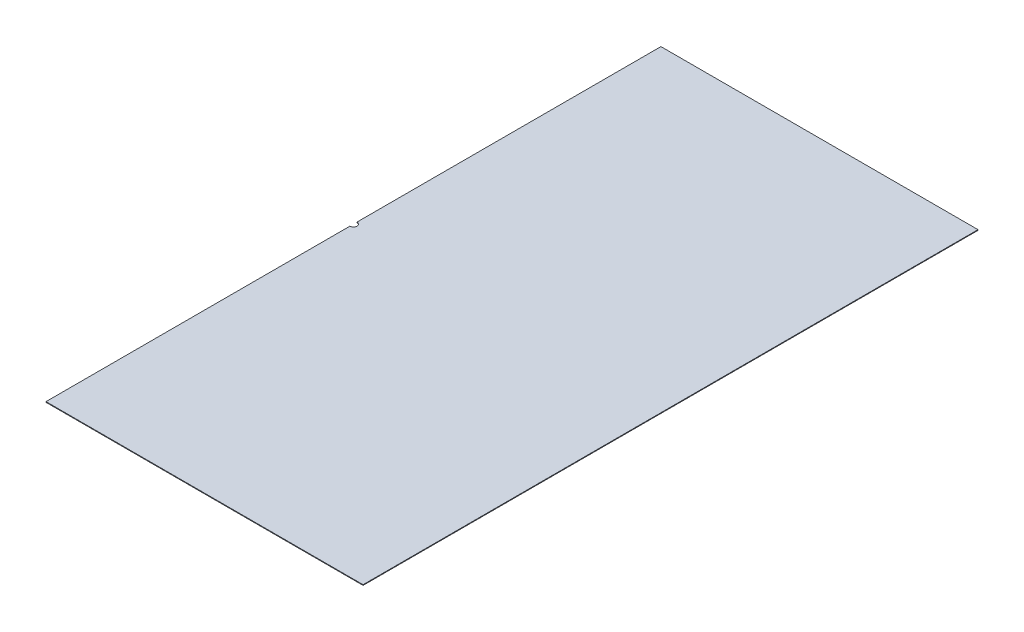
ISO-10303-21;
HEADER;
FILE_DESCRIPTION(('STEP AP214'),'2;1');
FILE_NAME('part.step','',(''),(''),'','','');
FILE_SCHEMA(('AUTOMOTIVE_DESIGN { 1 0 10303 214 1 1 1 1 }'));
ENDSEC;
DATA;
#1=APPLICATION_CONTEXT('core data for automotive mechanical design processes');
#2=APPLICATION_PROTOCOL_DEFINITION('international standard','automotive_design',2000,#1);
#3=PRODUCT_CONTEXT('',#1,'mechanical');
#4=PRODUCT('Part','Part','',(#3));
#5=PRODUCT_RELATED_PRODUCT_CATEGORY('part','',(#4));
#6=PRODUCT_DEFINITION_FORMATION('','',#4);
#7=PRODUCT_DEFINITION_CONTEXT('part definition',#1,'design');
#8=PRODUCT_DEFINITION('design','',#6,#7);
#9=PRODUCT_DEFINITION_SHAPE('','',#8);
#10=(LENGTH_UNIT() NAMED_UNIT(*) SI_UNIT(.MILLI.,.METRE.));
#11=(NAMED_UNIT(*) PLANE_ANGLE_UNIT() SI_UNIT($,.RADIAN.));
#12=(NAMED_UNIT(*) SI_UNIT($,.STERADIAN.) SOLID_ANGLE_UNIT());
#13=UNCERTAINTY_MEASURE_WITH_UNIT(LENGTH_MEASURE(1.E-05),#10,'distance_accuracy_value','');
#14=(GEOMETRIC_REPRESENTATION_CONTEXT(3) GLOBAL_UNCERTAINTY_ASSIGNED_CONTEXT((#13)) GLOBAL_UNIT_ASSIGNED_CONTEXT((#10,
#11,#12)) REPRESENTATION_CONTEXT('',''));
#15=CARTESIAN_POINT('',(0.,0.,0.));
#16=DIRECTION('',(0.,0.,1.));
#17=DIRECTION('',(1.,0.,0.));
#18=AXIS2_PLACEMENT_3D('',#15,#16,#17);
#19=CARTESIAN_POINT('',(-495.,2.,0.));
#20=DIRECTION('',(0.,-1.,0.));
#21=DIRECTION('',(0.,0.,-1.));
#22=AXIS2_PLACEMENT_3D('',#19,#20,#21);
#23=CYLINDRICAL_SURFACE('',#22,11.);
#24=CARTESIAN_POINT('',(-495.,0.,0.));
#25=DIRECTION('',(0.,1.,0.));
#26=DIRECTION('',(0.,0.,1.));
#27=AXIS2_PLACEMENT_3D('',#24,#25,#26);
#28=CIRCLE('',#27,11.);
#29=CARTESIAN_POINT('',(-495.,0.,11.));
#30=VERTEX_POINT('',#29);
#31=CARTESIAN_POINT('',(-495.,0.,-11.));
#32=VERTEX_POINT('',#31);
#33=EDGE_CURVE('E126',#30,#32,#28,.T.);
#34=ORIENTED_EDGE('',*,*,#33,.F.);
#35=DIRECTION('',(0.,-1.,0.));
#36=VECTOR('',#35,1.);
#37=CARTESIAN_POINT('',(-495.,2.,11.));
#38=LINE('',#37,#36);
#39=CARTESIAN_POINT('',(-495.,2.,11.));
#40=VERTEX_POINT('',#39);
#41=EDGE_CURVE('E11',#40,#30,#38,.T.);
#42=ORIENTED_EDGE('',*,*,#41,.F.);
#43=CARTESIAN_POINT('',(-495.,2.,0.));
#44=DIRECTION('',(0.,1.,0.));
#45=DIRECTION('',(0.,0.,1.));
#46=AXIS2_PLACEMENT_3D('',#43,#44,#45);
#47=CIRCLE('',#46,11.);
#48=CARTESIAN_POINT('',(-495.,2.,-11.));
#49=VERTEX_POINT('',#48);
#50=EDGE_CURVE('E145',#40,#49,#47,.T.);
#51=ORIENTED_EDGE('',*,*,#50,.T.);
#52=DIRECTION('',(0.,-1.,0.));
#53=VECTOR('',#52,1.);
#54=CARTESIAN_POINT('',(-495.,2.,-11.));
#55=LINE('',#54,#53);
#56=EDGE_CURVE('E87',#49,#32,#55,.T.);
#57=ORIENTED_EDGE('',*,*,#56,.T.);
#58=EDGE_LOOP('',(#34,#42,#51,#57));
#59=FACE_BOUND('',#58,.T.);
#60=ADVANCED_FACE('F41',(#59),#23,.F.);
#61=CARTESIAN_POINT('',(-495.,2.,0.));
#62=DIRECTION('',(1.,0.,0.));
#63=DIRECTION('',(0.,0.,-1.));
#64=AXIS2_PLACEMENT_3D('',#61,#62,#63);
#65=PLANE('',#64);
#66=DIRECTION('',(0.,0.,1.));
#67=VECTOR('',#66,1.);
#68=CARTESIAN_POINT('',(-495.,0.,0.));
#69=LINE('',#68,#67);
#70=CARTESIAN_POINT('',(-495.,0.,960.));
#71=VERTEX_POINT('',#70);
#72=EDGE_CURVE('E130',#30,#71,#69,.T.);
#73=ORIENTED_EDGE('',*,*,#72,.T.);
#74=DIRECTION('',(0.,-1.,0.));
#75=VECTOR('',#74,1.);
#76=CARTESIAN_POINT('',(-495.,2.,960.));
#77=LINE('',#76,#75);
#78=CARTESIAN_POINT('',(-495.,2.,960.));
#79=VERTEX_POINT('',#78);
#80=EDGE_CURVE('E50',#79,#71,#77,.T.);
#81=ORIENTED_EDGE('',*,*,#80,.F.);
#82=DIRECTION('',(0.,0.,1.));
#83=VECTOR('',#82,1.);
#84=CARTESIAN_POINT('',(-495.,2.,0.));
#85=LINE('',#84,#83);
#86=EDGE_CURVE('E165',#40,#79,#85,.T.);
#87=ORIENTED_EDGE('',*,*,#86,.F.);
#88=ORIENTED_EDGE('',*,*,#41,.T.);
#89=EDGE_LOOP('',(#73,#81,#87,#88));
#90=FACE_BOUND('',#89,.T.);
#91=ADVANCED_FACE('F158',(#90),#65,.F.);
#92=CARTESIAN_POINT('',(1.07657990266682E-13,2.,960.));
#93=DIRECTION('',(0.,0.,1.));
#94=DIRECTION('',(1.,0.,0.));
#95=AXIS2_PLACEMENT_3D('',#92,#93,#94);
#96=PLANE('',#95);
#97=DIRECTION('',(-1.,0.,0.));
#98=VECTOR('',#97,1.);
#99=CARTESIAN_POINT('',(1.07657990266682E-13,0.,960.));
#100=LINE('',#99,#98);
#101=CARTESIAN_POINT('',(495.,0.,960.));
#102=VERTEX_POINT('',#101);
#103=EDGE_CURVE('E134',#102,#71,#100,.T.);
#104=ORIENTED_EDGE('',*,*,#103,.F.);
#105=DIRECTION('',(0.,-1.,0.));
#106=VECTOR('',#105,1.);
#107=CARTESIAN_POINT('',(495.,2.,960.));
#108=LINE('',#107,#106);
#109=CARTESIAN_POINT('',(495.,2.,960.));
#110=VERTEX_POINT('',#109);
#111=EDGE_CURVE('E116',#110,#102,#108,.T.);
#112=ORIENTED_EDGE('',*,*,#111,.F.);
#113=DIRECTION('',(-1.,0.,0.));
#114=VECTOR('',#113,1.);
#115=CARTESIAN_POINT('',(1.07657990266682E-13,2.,960.));
#116=LINE('',#115,#114);
#117=EDGE_CURVE('E107',#110,#79,#116,.T.);
#118=ORIENTED_EDGE('',*,*,#117,.T.);
#119=ORIENTED_EDGE('',*,*,#80,.T.);
#120=EDGE_LOOP('',(#104,#112,#118,#119));
#121=FACE_BOUND('',#120,.T.);
#122=ADVANCED_FACE('F155',(#121),#96,.T.);
#123=CARTESIAN_POINT('',(495.,2.,0.));
#124=DIRECTION('',(-1.,0.,0.));
#125=DIRECTION('',(0.,0.,1.));
#126=AXIS2_PLACEMENT_3D('',#123,#124,#125);
#127=PLANE('',#126);
#128=DIRECTION('',(0.,0.,-1.));
#129=VECTOR('',#128,1.);
#130=CARTESIAN_POINT('',(495.,0.,0.));
#131=LINE('',#130,#129);
#132=CARTESIAN_POINT('',(495.,0.,-960.));
#133=VERTEX_POINT('',#132);
#134=EDGE_CURVE('E114',#102,#133,#131,.T.);
#135=ORIENTED_EDGE('',*,*,#134,.T.);
#136=DIRECTION('',(0.,-1.,0.));
#137=VECTOR('',#136,1.);
#138=CARTESIAN_POINT('',(495.,2.,-960.));
#139=LINE('',#138,#137);
#140=CARTESIAN_POINT('',(495.,2.,-960.));
#141=VERTEX_POINT('',#140);
#142=EDGE_CURVE('E111',#141,#133,#139,.T.);
#143=ORIENTED_EDGE('',*,*,#142,.F.);
#144=DIRECTION('',(0.,0.,-1.));
#145=VECTOR('',#144,1.);
#146=CARTESIAN_POINT('',(495.,2.,0.));
#147=LINE('',#146,#145);
#148=EDGE_CURVE('E101',#110,#141,#147,.T.);
#149=ORIENTED_EDGE('',*,*,#148,.F.);
#150=ORIENTED_EDGE('',*,*,#111,.T.);
#151=EDGE_LOOP('',(#135,#143,#149,#150));
#152=FACE_BOUND('',#151,.T.);
#153=ADVANCED_FACE('F112',(#152),#127,.F.);
#154=CARTESIAN_POINT('',(0.,2.,-960.));
#155=DIRECTION('',(0.,0.,1.));
#156=DIRECTION('',(1.,0.,0.));
#157=AXIS2_PLACEMENT_3D('',#154,#155,#156);
#158=PLANE('',#157);
#159=DIRECTION('',(-1.,0.,0.));
#160=VECTOR('',#159,1.);
#161=CARTESIAN_POINT('',(0.,0.,-960.));
#162=LINE('',#161,#160);
#163=CARTESIAN_POINT('',(-495.,0.,-960.));
#164=VERTEX_POINT('',#163);
#165=EDGE_CURVE('E80',#133,#164,#162,.T.);
#166=ORIENTED_EDGE('',*,*,#165,.T.);
#167=DIRECTION('',(0.,-1.,0.));
#168=VECTOR('',#167,1.);
#169=CARTESIAN_POINT('',(-495.,2.,-960.));
#170=LINE('',#169,#168);
#171=CARTESIAN_POINT('',(-495.,2.,-960.));
#172=VERTEX_POINT('',#171);
#173=EDGE_CURVE('E117',#172,#164,#170,.T.);
#174=ORIENTED_EDGE('',*,*,#173,.F.);
#175=DIRECTION('',(-1.,0.,0.));
#176=VECTOR('',#175,1.);
#177=CARTESIAN_POINT('',(0.,2.,-960.));
#178=LINE('',#177,#176);
#179=EDGE_CURVE('E105',#141,#172,#178,.T.);
#180=ORIENTED_EDGE('',*,*,#179,.F.);
#181=ORIENTED_EDGE('',*,*,#142,.T.);
#182=EDGE_LOOP('',(#166,#174,#180,#181));
#183=FACE_BOUND('',#182,.T.);
#184=ADVANCED_FACE('F119',(#183),#158,.F.);
#185=CARTESIAN_POINT('',(-495.,2.,0.));
#186=DIRECTION('',(1.,0.,0.));
#187=DIRECTION('',(0.,0.,-1.));
#188=AXIS2_PLACEMENT_3D('',#185,#186,#187);
#189=PLANE('',#188);
#190=DIRECTION('',(0.,0.,1.));
#191=VECTOR('',#190,1.);
#192=CARTESIAN_POINT('',(-495.,0.,0.));
#193=LINE('',#192,#191);
#194=EDGE_CURVE('E142',#164,#32,#193,.T.);
#195=ORIENTED_EDGE('',*,*,#194,.T.);
#196=ORIENTED_EDGE('',*,*,#56,.F.);
#197=DIRECTION('',(0.,0.,1.));
#198=VECTOR('',#197,1.);
#199=CARTESIAN_POINT('',(-495.,2.,0.));
#200=LINE('',#199,#198);
#201=EDGE_CURVE('E58',#172,#49,#200,.T.);
#202=ORIENTED_EDGE('',*,*,#201,.F.);
#203=ORIENTED_EDGE('',*,*,#173,.T.);
#204=EDGE_LOOP('',(#195,#196,#202,#203));
#205=FACE_BOUND('',#204,.T.);
#206=ADVANCED_FACE('F163',(#205),#189,.F.);
#207=CARTESIAN_POINT('',(0.,2.,0.));
#208=DIRECTION('',(0.,1.,0.));
#209=DIRECTION('',(0.,0.,1.));
#210=AXIS2_PLACEMENT_3D('',#207,#208,#209);
#211=PLANE('',#210);
#212=ORIENTED_EDGE('',*,*,#50,.F.);
#213=ORIENTED_EDGE('',*,*,#86,.T.);
#214=ORIENTED_EDGE('',*,*,#117,.F.);
#215=ORIENTED_EDGE('',*,*,#148,.T.);
#216=ORIENTED_EDGE('',*,*,#179,.T.);
#217=ORIENTED_EDGE('',*,*,#201,.T.);
#218=EDGE_LOOP('',(#212,#213,#214,#215,#216,#217));
#219=FACE_BOUND('',#218,.T.);
#220=ADVANCED_FACE('F103',(#219),#211,.T.);
#221=CARTESIAN_POINT('',(0.,0.,0.));
#222=DIRECTION('',(0.,1.,0.));
#223=DIRECTION('',(0.,0.,1.));
#224=AXIS2_PLACEMENT_3D('',#221,#222,#223);
#225=PLANE('',#224);
#226=ORIENTED_EDGE('',*,*,#33,.T.);
#227=ORIENTED_EDGE('',*,*,#194,.F.);
#228=ORIENTED_EDGE('',*,*,#165,.F.);
#229=ORIENTED_EDGE('',*,*,#134,.F.);
#230=ORIENTED_EDGE('',*,*,#103,.T.);
#231=ORIENTED_EDGE('',*,*,#72,.F.);
#232=EDGE_LOOP('',(#226,#227,#228,#229,#230,#231));
#233=FACE_BOUND('',#232,.T.);
#234=ADVANCED_FACE('F160',(#233),#225,.F.);
#235=CLOSED_SHELL('',(#60,#91,#122,#153,#184,#206,#220,#234));
#236=MANIFOLD_SOLID_BREP('B2',#235);
#237=ADVANCED_BREP_SHAPE_REPRESENTATION('',(#18,#236),#14);
#238=SHAPE_DEFINITION_REPRESENTATION(#9,#237);
ENDSEC;
END-ISO-10303-21;
